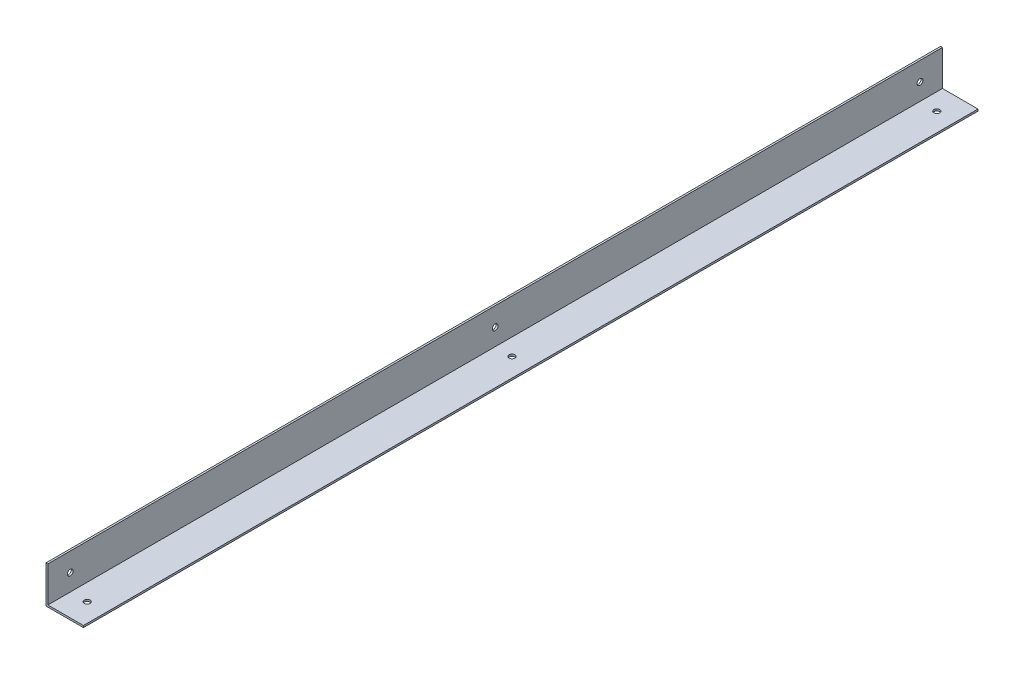
ISO-10303-21;
HEADER;
FILE_DESCRIPTION(('STEP AP214'),'2;1');
FILE_NAME('part.step','',(''),(''),'','','');
FILE_SCHEMA(('AUTOMOTIVE_DESIGN { 1 0 10303 214 1 1 1 1 }'));
ENDSEC;
DATA;
#1=APPLICATION_CONTEXT('core data for automotive mechanical design processes');
#2=APPLICATION_PROTOCOL_DEFINITION('international standard','automotive_design',2000,#1);
#3=PRODUCT_CONTEXT('',#1,'mechanical');
#4=PRODUCT('Part','Part','',(#3));
#5=PRODUCT_RELATED_PRODUCT_CATEGORY('part','',(#4));
#6=PRODUCT_DEFINITION_FORMATION('','',#4);
#7=PRODUCT_DEFINITION_CONTEXT('part definition',#1,'design');
#8=PRODUCT_DEFINITION('design','',#6,#7);
#9=PRODUCT_DEFINITION_SHAPE('','',#8);
#10=(LENGTH_UNIT() NAMED_UNIT(*) SI_UNIT(.MILLI.,.METRE.));
#11=(NAMED_UNIT(*) PLANE_ANGLE_UNIT() SI_UNIT($,.RADIAN.));
#12=(NAMED_UNIT(*) SI_UNIT($,.STERADIAN.) SOLID_ANGLE_UNIT());
#13=UNCERTAINTY_MEASURE_WITH_UNIT(LENGTH_MEASURE(1.E-05),#10,'distance_accuracy_value','');
#14=(GEOMETRIC_REPRESENTATION_CONTEXT(3) GLOBAL_UNCERTAINTY_ASSIGNED_CONTEXT((#13)) GLOBAL_UNIT_ASSIGNED_CONTEXT((#10,
#11,#12)) REPRESENTATION_CONTEXT('',''));
#15=CARTESIAN_POINT('',(0.,0.,0.));
#16=DIRECTION('',(0.,0.,1.));
#17=DIRECTION('',(1.,0.,0.));
#18=AXIS2_PLACEMENT_3D('',#15,#16,#17);
#19=CARTESIAN_POINT('',(31.75,0.,758.825));
#20=DIRECTION('',(0.,1.,0.));
#21=DIRECTION('',(-1.,0.,0.));
#22=AXIS2_PLACEMENT_3D('',#19,#20,#21);
#23=PLANE('',#22);
#24=CARTESIAN_POINT('',(15.875,0.,379.4125));
#25=DIRECTION('',(0.,-1.,0.));
#26=DIRECTION('',(0.,0.,-1.));
#27=AXIS2_PLACEMENT_3D('',#24,#25,#26);
#28=CIRCLE('',#27,2.45744999999999);
#29=CARTESIAN_POINT('',(15.875,0.,376.95505));
#30=VERTEX_POINT('',#29);
#31=EDGE_CURVE('E165',#30,#30,#28,.T.);
#32=ORIENTED_EDGE('',*,*,#31,.F.);
#33=EDGE_LOOP('',(#32));
#34=FACE_BOUND('',#33,.T.);
#35=CARTESIAN_POINT('',(15.8750000000001,0.,19.05));
#36=DIRECTION('',(0.,-1.,0.));
#37=DIRECTION('',(0.,0.,-1.));
#38=AXIS2_PLACEMENT_3D('',#35,#36,#37);
#39=CIRCLE('',#38,2.45744999999999);
#40=CARTESIAN_POINT('',(15.8750000000001,0.,16.59255));
#41=VERTEX_POINT('',#40);
#42=EDGE_CURVE('E169',#41,#41,#39,.T.);
#43=ORIENTED_EDGE('',*,*,#42,.F.);
#44=EDGE_LOOP('',(#43));
#45=FACE_BOUND('',#44,.T.);
#46=CARTESIAN_POINT('',(15.875,0.,739.775));
#47=DIRECTION('',(0.,-1.,0.));
#48=DIRECTION('',(0.,0.,-1.));
#49=AXIS2_PLACEMENT_3D('',#46,#47,#48);
#50=CIRCLE('',#49,2.45744999999999);
#51=CARTESIAN_POINT('',(15.875,0.,737.31755));
#52=VERTEX_POINT('',#51);
#53=EDGE_CURVE('E172',#52,#52,#50,.T.);
#54=ORIENTED_EDGE('',*,*,#53,.F.);
#55=EDGE_LOOP('',(#54));
#56=FACE_BOUND('',#55,.T.);
#57=DIRECTION('',(1.,0.,0.));
#58=VECTOR('',#57,1.);
#59=CARTESIAN_POINT('',(31.75,0.,0.));
#60=LINE('',#59,#58);
#61=CARTESIAN_POINT('',(0.,0.,0.));
#62=VERTEX_POINT('',#61);
#63=CARTESIAN_POINT('',(31.75,0.,0.));
#64=VERTEX_POINT('',#63);
#65=EDGE_CURVE('E118',#62,#64,#60,.T.);
#66=ORIENTED_EDGE('',*,*,#65,.T.);
#67=DIRECTION('',(0.,0.,-1.));
#68=VECTOR('',#67,1.);
#69=CARTESIAN_POINT('',(31.75,0.,758.825));
#70=LINE('',#69,#68);
#71=CARTESIAN_POINT('',(31.75,0.,758.825));
#72=VERTEX_POINT('',#71);
#73=EDGE_CURVE('E11',#72,#64,#70,.T.);
#74=ORIENTED_EDGE('',*,*,#73,.F.);
#75=DIRECTION('',(1.,0.,0.));
#76=VECTOR('',#75,1.);
#77=CARTESIAN_POINT('',(31.75,0.,758.825));
#78=LINE('',#77,#76);
#79=CARTESIAN_POINT('',(0.,0.,758.825));
#80=VERTEX_POINT('',#79);
#81=EDGE_CURVE('E129',#80,#72,#78,.T.);
#82=ORIENTED_EDGE('',*,*,#81,.F.);
#83=DIRECTION('',(0.,0.,-1.));
#84=VECTOR('',#83,1.);
#85=CARTESIAN_POINT('',(0.,0.,758.825));
#86=LINE('',#85,#84);
#87=EDGE_CURVE('E114',#80,#62,#86,.T.);
#88=ORIENTED_EDGE('',*,*,#87,.T.);
#89=EDGE_LOOP('',(#66,#74,#82,#88));
#90=FACE_BOUND('',#89,.T.);
#91=ADVANCED_FACE('F33',(#34,#45,#56,#90),#23,.F.);
#92=CARTESIAN_POINT('',(31.75,1.5875,758.825));
#93=DIRECTION('',(-1.,0.,0.));
#94=DIRECTION('',(0.,0.,1.));
#95=AXIS2_PLACEMENT_3D('',#92,#93,#94);
#96=PLANE('',#95);
#97=DIRECTION('',(0.,1.,0.));
#98=VECTOR('',#97,1.);
#99=CARTESIAN_POINT('',(31.75,1.5875,0.));
#100=LINE('',#99,#98);
#101=CARTESIAN_POINT('',(31.75,1.5875,0.));
#102=VERTEX_POINT('',#101);
#103=EDGE_CURVE('E121',#64,#102,#100,.T.);
#104=ORIENTED_EDGE('',*,*,#103,.T.);
#105=DIRECTION('',(0.,0.,-1.));
#106=VECTOR('',#105,1.);
#107=CARTESIAN_POINT('',(31.75,1.5875,758.825));
#108=LINE('',#107,#106);
#109=CARTESIAN_POINT('',(31.75,1.5875,758.825));
#110=VERTEX_POINT('',#109);
#111=EDGE_CURVE('E42',#110,#102,#108,.T.);
#112=ORIENTED_EDGE('',*,*,#111,.F.);
#113=DIRECTION('',(0.,1.,0.));
#114=VECTOR('',#113,1.);
#115=CARTESIAN_POINT('',(31.75,1.5875,758.825));
#116=LINE('',#115,#114);
#117=EDGE_CURVE('E87',#72,#110,#116,.T.);
#118=ORIENTED_EDGE('',*,*,#117,.F.);
#119=ORIENTED_EDGE('',*,*,#73,.T.);
#120=EDGE_LOOP('',(#104,#112,#118,#119));
#121=FACE_BOUND('',#120,.T.);
#122=ADVANCED_FACE('F157',(#121),#96,.F.);
#123=CARTESIAN_POINT('',(1.5875,1.5875,758.825));
#124=DIRECTION('',(0.,-1.,0.));
#125=DIRECTION('',(0.,0.,-1.));
#126=AXIS2_PLACEMENT_3D('',#123,#124,#125);
#127=PLANE('',#126);
#128=CARTESIAN_POINT('',(15.875,1.5875,379.4125));
#129=DIRECTION('',(0.,-1.,0.));
#130=DIRECTION('',(0.,0.,-1.));
#131=AXIS2_PLACEMENT_3D('',#128,#129,#130);
#132=CIRCLE('',#131,2.45744999999999);
#133=CARTESIAN_POINT('',(15.875,1.5875,376.95505));
#134=VERTEX_POINT('',#133);
#135=EDGE_CURVE('E234',#134,#134,#132,.T.);
#136=ORIENTED_EDGE('',*,*,#135,.T.);
#137=EDGE_LOOP('',(#136));
#138=FACE_BOUND('',#137,.T.);
#139=CARTESIAN_POINT('',(15.8750000000001,1.5875,19.05));
#140=DIRECTION('',(0.,-1.,0.));
#141=DIRECTION('',(0.,0.,-1.));
#142=AXIS2_PLACEMENT_3D('',#139,#140,#141);
#143=CIRCLE('',#142,2.45744999999999);
#144=CARTESIAN_POINT('',(15.8750000000001,1.5875,16.59255));
#145=VERTEX_POINT('',#144);
#146=EDGE_CURVE('E36',#145,#145,#143,.T.);
#147=ORIENTED_EDGE('',*,*,#146,.T.);
#148=EDGE_LOOP('',(#147));
#149=FACE_BOUND('',#148,.T.);
#150=CARTESIAN_POINT('',(15.875,1.5875,739.775));
#151=DIRECTION('',(0.,-1.,0.));
#152=DIRECTION('',(0.,0.,-1.));
#153=AXIS2_PLACEMENT_3D('',#150,#151,#152);
#154=CIRCLE('',#153,2.45744999999999);
#155=CARTESIAN_POINT('',(15.875,1.5875,737.31755));
#156=VERTEX_POINT('',#155);
#157=EDGE_CURVE('E174',#156,#156,#154,.T.);
#158=ORIENTED_EDGE('',*,*,#157,.T.);
#159=EDGE_LOOP('',(#158));
#160=FACE_BOUND('',#159,.T.);
#161=DIRECTION('',(-1.,0.,0.));
#162=VECTOR('',#161,1.);
#163=CARTESIAN_POINT('',(1.5875,1.5875,0.));
#164=LINE('',#163,#162);
#165=CARTESIAN_POINT('',(1.5875,1.5875,0.));
#166=VERTEX_POINT('',#165);
#167=EDGE_CURVE('E124',#102,#166,#164,.T.);
#168=ORIENTED_EDGE('',*,*,#167,.T.);
#169=DIRECTION('',(0.,0.,-1.));
#170=VECTOR('',#169,1.);
#171=CARTESIAN_POINT('',(1.5875,1.5875,758.825));
#172=LINE('',#171,#170);
#173=CARTESIAN_POINT('',(1.5875,1.5875,758.825));
#174=VERTEX_POINT('',#173);
#175=EDGE_CURVE('E109',#174,#166,#172,.T.);
#176=ORIENTED_EDGE('',*,*,#175,.F.);
#177=DIRECTION('',(-1.,0.,0.));
#178=VECTOR('',#177,1.);
#179=CARTESIAN_POINT('',(1.5875,1.5875,758.825));
#180=LINE('',#179,#178);
#181=EDGE_CURVE('E100',#110,#174,#180,.T.);
#182=ORIENTED_EDGE('',*,*,#181,.F.);
#183=ORIENTED_EDGE('',*,*,#111,.T.);
#184=EDGE_LOOP('',(#168,#176,#182,#183));
#185=FACE_BOUND('',#184,.T.);
#186=ADVANCED_FACE('F136',(#138,#149,#160,#185),#127,.F.);
#187=CARTESIAN_POINT('',(1.5875,31.75,758.825));
#188=DIRECTION('',(-1.,0.,0.));
#189=DIRECTION('',(0.,-1.,0.));
#190=AXIS2_PLACEMENT_3D('',#187,#188,#189);
#191=PLANE('',#190);
#192=CARTESIAN_POINT('',(1.5875,15.875,19.05));
#193=DIRECTION('',(-1.,0.,0.));
#194=DIRECTION('',(0.,-1.,0.));
#195=AXIS2_PLACEMENT_3D('',#192,#193,#194);
#196=CIRCLE('',#195,2.45744999999999);
#197=CARTESIAN_POINT('',(1.5875,13.41755,19.05));
#198=VERTEX_POINT('',#197);
#199=EDGE_CURVE('E185',#198,#198,#196,.T.);
#200=ORIENTED_EDGE('',*,*,#199,.T.);
#201=EDGE_LOOP('',(#200));
#202=FACE_BOUND('',#201,.T.);
#203=CARTESIAN_POINT('',(1.5875,15.875,379.4125));
#204=DIRECTION('',(-1.,0.,0.));
#205=DIRECTION('',(0.,-1.,0.));
#206=AXIS2_PLACEMENT_3D('',#203,#204,#205);
#207=CIRCLE('',#206,2.45744999999999);
#208=CARTESIAN_POINT('',(1.5875,13.41755,379.4125));
#209=VERTEX_POINT('',#208);
#210=EDGE_CURVE('E191',#209,#209,#207,.T.);
#211=ORIENTED_EDGE('',*,*,#210,.T.);
#212=EDGE_LOOP('',(#211));
#213=FACE_BOUND('',#212,.T.);
#214=CARTESIAN_POINT('',(1.5875,15.875,739.775));
#215=DIRECTION('',(-1.,0.,0.));
#216=DIRECTION('',(0.,-1.,0.));
#217=AXIS2_PLACEMENT_3D('',#214,#215,#216);
#218=CIRCLE('',#217,2.45744999999999);
#219=CARTESIAN_POINT('',(1.5875,13.41755,739.775));
#220=VERTEX_POINT('',#219);
#221=EDGE_CURVE('E122',#220,#220,#218,.T.);
#222=ORIENTED_EDGE('',*,*,#221,.T.);
#223=EDGE_LOOP('',(#222));
#224=FACE_BOUND('',#223,.T.);
#225=DIRECTION('',(0.,1.,0.));
#226=VECTOR('',#225,1.);
#227=CARTESIAN_POINT('',(1.5875,31.75,0.));
#228=LINE('',#227,#226);
#229=CARTESIAN_POINT('',(1.5875,31.75,0.));
#230=VERTEX_POINT('',#229);
#231=EDGE_CURVE('E108',#166,#230,#228,.T.);
#232=ORIENTED_EDGE('',*,*,#231,.T.);
#233=DIRECTION('',(0.,0.,-1.));
#234=VECTOR('',#233,1.);
#235=CARTESIAN_POINT('',(1.5875,31.75,758.825));
#236=LINE('',#235,#234);
#237=CARTESIAN_POINT('',(1.5875,31.75,758.825));
#238=VERTEX_POINT('',#237);
#239=EDGE_CURVE('E105',#238,#230,#236,.T.);
#240=ORIENTED_EDGE('',*,*,#239,.F.);
#241=DIRECTION('',(0.,1.,0.));
#242=VECTOR('',#241,1.);
#243=CARTESIAN_POINT('',(1.5875,31.75,758.825));
#244=LINE('',#243,#242);
#245=EDGE_CURVE('E94',#174,#238,#244,.T.);
#246=ORIENTED_EDGE('',*,*,#245,.F.);
#247=ORIENTED_EDGE('',*,*,#175,.T.);
#248=EDGE_LOOP('',(#232,#240,#246,#247));
#249=FACE_BOUND('',#248,.T.);
#250=ADVANCED_FACE('F106',(#202,#213,#224,#249),#191,.F.);
#251=CARTESIAN_POINT('',(0.,31.75,758.825));
#252=DIRECTION('',(0.,-1.,0.));
#253=DIRECTION('',(0.,0.,-1.));
#254=AXIS2_PLACEMENT_3D('',#251,#252,#253);
#255=PLANE('',#254);
#256=DIRECTION('',(-1.,0.,0.));
#257=VECTOR('',#256,1.);
#258=CARTESIAN_POINT('',(0.,31.75,0.));
#259=LINE('',#258,#257);
#260=CARTESIAN_POINT('',(0.,31.75,0.));
#261=VERTEX_POINT('',#260);
#262=EDGE_CURVE('E73',#230,#261,#259,.T.);
#263=ORIENTED_EDGE('',*,*,#262,.T.);
#264=DIRECTION('',(0.,0.,-1.));
#265=VECTOR('',#264,1.);
#266=CARTESIAN_POINT('',(0.,31.75,758.825));
#267=LINE('',#266,#265);
#268=CARTESIAN_POINT('',(0.,31.75,758.825));
#269=VERTEX_POINT('',#268);
#270=EDGE_CURVE('E110',#269,#261,#267,.T.);
#271=ORIENTED_EDGE('',*,*,#270,.F.);
#272=DIRECTION('',(-1.,0.,0.));
#273=VECTOR('',#272,1.);
#274=CARTESIAN_POINT('',(0.,31.75,758.825));
#275=LINE('',#274,#273);
#276=EDGE_CURVE('E98',#238,#269,#275,.T.);
#277=ORIENTED_EDGE('',*,*,#276,.F.);
#278=ORIENTED_EDGE('',*,*,#239,.T.);
#279=EDGE_LOOP('',(#263,#271,#277,#278));
#280=FACE_BOUND('',#279,.T.);
#281=ADVANCED_FACE('F112',(#280),#255,.F.);
#282=CARTESIAN_POINT('',(0.,0.,758.825));
#283=DIRECTION('',(1.,0.,0.));
#284=DIRECTION('',(0.,0.,-1.));
#285=AXIS2_PLACEMENT_3D('',#282,#283,#284);
#286=PLANE('',#285);
#287=CARTESIAN_POINT('',(0.,15.875,19.05));
#288=DIRECTION('',(-1.,0.,0.));
#289=DIRECTION('',(0.,0.,1.));
#290=AXIS2_PLACEMENT_3D('',#287,#288,#289);
#291=CIRCLE('',#290,2.45744999999999);
#292=CARTESIAN_POINT('',(0.,15.875,21.50745));
#293=VERTEX_POINT('',#292);
#294=EDGE_CURVE('E177',#293,#293,#291,.T.);
#295=ORIENTED_EDGE('',*,*,#294,.F.);
#296=EDGE_LOOP('',(#295));
#297=FACE_BOUND('',#296,.T.);
#298=CARTESIAN_POINT('',(0.,15.875,379.4125));
#299=DIRECTION('',(-1.,0.,0.));
#300=DIRECTION('',(0.,0.,1.));
#301=AXIS2_PLACEMENT_3D('',#298,#299,#300);
#302=CIRCLE('',#301,2.45744999999999);
#303=CARTESIAN_POINT('',(0.,15.875,381.86995));
#304=VERTEX_POINT('',#303);
#305=EDGE_CURVE('E188',#304,#304,#302,.T.);
#306=ORIENTED_EDGE('',*,*,#305,.F.);
#307=EDGE_LOOP('',(#306));
#308=FACE_BOUND('',#307,.T.);
#309=CARTESIAN_POINT('',(0.,15.875,739.775));
#310=DIRECTION('',(-1.,0.,0.));
#311=DIRECTION('',(0.,0.,1.));
#312=AXIS2_PLACEMENT_3D('',#309,#310,#311);
#313=CIRCLE('',#312,2.45744999999999);
#314=CARTESIAN_POINT('',(0.,15.875,742.23245));
#315=VERTEX_POINT('',#314);
#316=EDGE_CURVE('E194',#315,#315,#313,.T.);
#317=ORIENTED_EDGE('',*,*,#316,.F.);
#318=EDGE_LOOP('',(#317));
#319=FACE_BOUND('',#318,.T.);
#320=DIRECTION('',(0.,-1.,0.));
#321=VECTOR('',#320,1.);
#322=CARTESIAN_POINT('',(0.,0.,0.));
#323=LINE('',#322,#321);
#324=EDGE_CURVE('E79',#261,#62,#323,.T.);
#325=ORIENTED_EDGE('',*,*,#324,.T.);
#326=ORIENTED_EDGE('',*,*,#87,.F.);
#327=DIRECTION('',(0.,-1.,0.));
#328=VECTOR('',#327,1.);
#329=CARTESIAN_POINT('',(0.,0.,758.825));
#330=LINE('',#329,#328);
#331=EDGE_CURVE('E50',#269,#80,#330,.T.);
#332=ORIENTED_EDGE('',*,*,#331,.F.);
#333=ORIENTED_EDGE('',*,*,#270,.T.);
#334=EDGE_LOOP('',(#325,#326,#332,#333));
#335=FACE_BOUND('',#334,.T.);
#336=ADVANCED_FACE('F143',(#297,#308,#319,#335),#286,.F.);
#337=CARTESIAN_POINT('',(0.,0.,758.825));
#338=DIRECTION('',(0.,0.,-1.));
#339=DIRECTION('',(-1.,0.,0.));
#340=AXIS2_PLACEMENT_3D('',#337,#338,#339);
#341=PLANE('',#340);
#342=ORIENTED_EDGE('',*,*,#81,.T.);
#343=ORIENTED_EDGE('',*,*,#117,.T.);
#344=ORIENTED_EDGE('',*,*,#181,.T.);
#345=ORIENTED_EDGE('',*,*,#245,.T.);
#346=ORIENTED_EDGE('',*,*,#276,.T.);
#347=ORIENTED_EDGE('',*,*,#331,.T.);
#348=EDGE_LOOP('',(#342,#343,#344,#345,#346,#347));
#349=FACE_BOUND('',#348,.T.);
#350=ADVANCED_FACE('F96',(#349),#341,.F.);
#351=CARTESIAN_POINT('',(0.,0.,0.));
#352=DIRECTION('',(0.,0.,-1.));
#353=DIRECTION('',(-1.,0.,0.));
#354=AXIS2_PLACEMENT_3D('',#351,#352,#353);
#355=PLANE('',#354);
#356=ORIENTED_EDGE('',*,*,#65,.F.);
#357=ORIENTED_EDGE('',*,*,#324,.F.);
#358=ORIENTED_EDGE('',*,*,#262,.F.);
#359=ORIENTED_EDGE('',*,*,#231,.F.);
#360=ORIENTED_EDGE('',*,*,#167,.F.);
#361=ORIENTED_EDGE('',*,*,#103,.F.);
#362=EDGE_LOOP('',(#356,#357,#358,#359,#360,#361));
#363=FACE_BOUND('',#362,.T.);
#364=ADVANCED_FACE('F139',(#363),#355,.T.);
#365=CARTESIAN_POINT('',(0.,15.875,739.775));
#366=DIRECTION('',(-1.,0.,0.));
#367=DIRECTION('',(0.,0.,1.));
#368=AXIS2_PLACEMENT_3D('',#365,#366,#367);
#369=CYLINDRICAL_SURFACE('',#368,2.45744999999999);
#370=ORIENTED_EDGE('',*,*,#316,.T.);
#371=EDGE_LOOP('',(#370));
#372=FACE_BOUND('',#371,.T.);
#373=ORIENTED_EDGE('',*,*,#221,.F.);
#374=EDGE_LOOP('',(#373));
#375=FACE_BOUND('',#374,.T.);
#376=ADVANCED_FACE('F203',(#372,#375),#369,.F.);
#377=CARTESIAN_POINT('',(0.,15.875,379.4125));
#378=DIRECTION('',(-1.,0.,0.));
#379=DIRECTION('',(0.,0.,1.));
#380=AXIS2_PLACEMENT_3D('',#377,#378,#379);
#381=CYLINDRICAL_SURFACE('',#380,2.45744999999999);
#382=ORIENTED_EDGE('',*,*,#305,.T.);
#383=EDGE_LOOP('',(#382));
#384=FACE_BOUND('',#383,.T.);
#385=ORIENTED_EDGE('',*,*,#210,.F.);
#386=EDGE_LOOP('',(#385));
#387=FACE_BOUND('',#386,.T.);
#388=ADVANCED_FACE('F205',(#384,#387),#381,.F.);
#389=CARTESIAN_POINT('',(0.,15.875,19.05));
#390=DIRECTION('',(-1.,0.,0.));
#391=DIRECTION('',(0.,0.,1.));
#392=AXIS2_PLACEMENT_3D('',#389,#390,#391);
#393=CYLINDRICAL_SURFACE('',#392,2.45744999999999);
#394=ORIENTED_EDGE('',*,*,#294,.T.);
#395=EDGE_LOOP('',(#394));
#396=FACE_BOUND('',#395,.T.);
#397=ORIENTED_EDGE('',*,*,#199,.F.);
#398=EDGE_LOOP('',(#397));
#399=FACE_BOUND('',#398,.T.);
#400=ADVANCED_FACE('F212',(#396,#399),#393,.F.);
#401=CARTESIAN_POINT('',(15.875,0.,739.775));
#402=DIRECTION('',(0.,-1.,0.));
#403=DIRECTION('',(0.,0.,-1.));
#404=AXIS2_PLACEMENT_3D('',#401,#402,#403);
#405=CYLINDRICAL_SURFACE('',#404,2.45744999999999);
#406=ORIENTED_EDGE('',*,*,#53,.T.);
#407=EDGE_LOOP('',(#406));
#408=FACE_BOUND('',#407,.T.);
#409=ORIENTED_EDGE('',*,*,#157,.F.);
#410=EDGE_LOOP('',(#409));
#411=FACE_BOUND('',#410,.T.);
#412=ADVANCED_FACE('F218',(#408,#411),#405,.F.);
#413=CARTESIAN_POINT('',(15.8750000000001,0.,19.05));
#414=DIRECTION('',(0.,-1.,0.));
#415=DIRECTION('',(0.,0.,-1.));
#416=AXIS2_PLACEMENT_3D('',#413,#414,#415);
#417=CYLINDRICAL_SURFACE('',#416,2.45744999999999);
#418=ORIENTED_EDGE('',*,*,#42,.T.);
#419=EDGE_LOOP('',(#418));
#420=FACE_BOUND('',#419,.T.);
#421=ORIENTED_EDGE('',*,*,#146,.F.);
#422=EDGE_LOOP('',(#421));
#423=FACE_BOUND('',#422,.T.);
#424=ADVANCED_FACE('F222',(#420,#423),#417,.F.);
#425=CARTESIAN_POINT('',(15.875,0.,379.4125));
#426=DIRECTION('',(0.,-1.,0.));
#427=DIRECTION('',(0.,0.,-1.));
#428=AXIS2_PLACEMENT_3D('',#425,#426,#427);
#429=CYLINDRICAL_SURFACE('',#428,2.45744999999999);
#430=ORIENTED_EDGE('',*,*,#31,.T.);
#431=EDGE_LOOP('',(#430));
#432=FACE_BOUND('',#431,.T.);
#433=ORIENTED_EDGE('',*,*,#135,.F.);
#434=EDGE_LOOP('',(#433));
#435=FACE_BOUND('',#434,.T.);
#436=ADVANCED_FACE('F225',(#432,#435),#429,.F.);
#437=CLOSED_SHELL('',(#91,#122,#186,#250,#281,#336,#350,#364,#376,#388,#400,#412,#424,#436));
#438=MANIFOLD_SOLID_BREP('B2',#437);
#439=ADVANCED_BREP_SHAPE_REPRESENTATION('',(#18,#438),#14);
#440=SHAPE_DEFINITION_REPRESENTATION(#9,#439);
ENDSEC;
END-ISO-10303-21;
